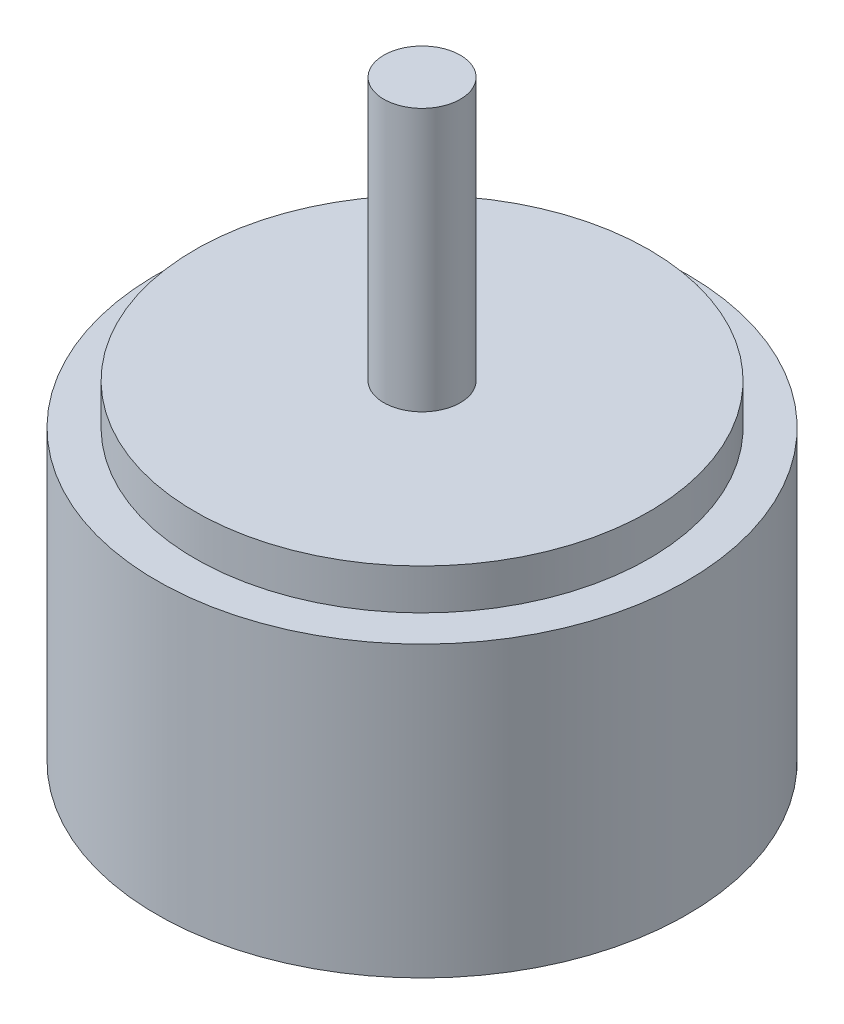
ISO-10303-21;
HEADER;
FILE_DESCRIPTION(('STEP AP214'),'2;1');
FILE_NAME('part.step','',(''),(''),'','','');
FILE_SCHEMA(('AUTOMOTIVE_DESIGN { 1 0 10303 214 1 1 1 1 }'));
ENDSEC;
DATA;
#1=APPLICATION_CONTEXT('core data for automotive mechanical design processes');
#2=APPLICATION_PROTOCOL_DEFINITION('international standard','automotive_design',2000,#1);
#3=PRODUCT_CONTEXT('',#1,'mechanical');
#4=PRODUCT('Part','Part','',(#3));
#5=PRODUCT_RELATED_PRODUCT_CATEGORY('part','',(#4));
#6=PRODUCT_DEFINITION_FORMATION('','',#4);
#7=PRODUCT_DEFINITION_CONTEXT('part definition',#1,'design');
#8=PRODUCT_DEFINITION('design','',#6,#7);
#9=PRODUCT_DEFINITION_SHAPE('','',#8);
#10=(LENGTH_UNIT() NAMED_UNIT(*) SI_UNIT(.MILLI.,.METRE.));
#11=(NAMED_UNIT(*) PLANE_ANGLE_UNIT() SI_UNIT($,.RADIAN.));
#12=(NAMED_UNIT(*) SI_UNIT($,.STERADIAN.) SOLID_ANGLE_UNIT());
#13=UNCERTAINTY_MEASURE_WITH_UNIT(LENGTH_MEASURE(1.E-05),#10,'distance_accuracy_value','');
#14=(GEOMETRIC_REPRESENTATION_CONTEXT(3) GLOBAL_UNCERTAINTY_ASSIGNED_CONTEXT((#13)) GLOBAL_UNIT_ASSIGNED_CONTEXT((#10,
#11,#12)) REPRESENTATION_CONTEXT('',''));
#15=CARTESIAN_POINT('',(0.,0.,0.));
#16=DIRECTION('',(0.,0.,1.));
#17=DIRECTION('',(1.,0.,0.));
#18=AXIS2_PLACEMENT_3D('',#15,#16,#17);
#19=CARTESIAN_POINT('',(0.,0.,0.));
#20=DIRECTION('',(0.,-1.,0.));
#21=DIRECTION('',(0.,0.,-1.));
#22=AXIS2_PLACEMENT_3D('',#19,#20,#21);
#23=PLANE('',#22);
#24=CARTESIAN_POINT('',(0.,0.,0.));
#25=DIRECTION('',(0.,-1.,0.));
#26=DIRECTION('',(0.,0.,-1.));
#27=AXIS2_PLACEMENT_3D('',#24,#25,#26);
#28=CIRCLE('',#27,11.1000000000021);
#29=CARTESIAN_POINT('',(0.,0.,-11.1000000000021));
#30=VERTEX_POINT('',#29);
#31=EDGE_CURVE('E10',#30,#30,#28,.T.);
#32=ORIENTED_EDGE('',*,*,#31,.T.);
#33=EDGE_LOOP('',(#32));
#34=FACE_BOUND('',#33,.T.);
#35=ADVANCED_FACE('F37',(#34),#23,.T.);
#36=CARTESIAN_POINT('',(0.,0.,0.));
#37=DIRECTION('',(0.,-1.,0.));
#38=DIRECTION('',(0.,0.,-1.));
#39=AXIS2_PLACEMENT_3D('',#36,#37,#38);
#40=CYLINDRICAL_SURFACE('',#39,11.100000000001);
#41=CARTESIAN_POINT('',(0.,12.1,0.));
#42=DIRECTION('',(0.,-1.,0.));
#43=DIRECTION('',(0.,0.,-1.));
#44=AXIS2_PLACEMENT_3D('',#41,#42,#43);
#45=CIRCLE('',#44,11.1);
#46=CARTESIAN_POINT('',(0.,12.1,-11.1));
#47=VERTEX_POINT('',#46);
#48=EDGE_CURVE('E43',#47,#47,#45,.T.);
#49=ORIENTED_EDGE('',*,*,#48,.T.);
#50=EDGE_LOOP('',(#49));
#51=FACE_BOUND('',#50,.T.);
#52=ORIENTED_EDGE('',*,*,#31,.F.);
#53=EDGE_LOOP('',(#52));
#54=FACE_BOUND('',#53,.T.);
#55=ADVANCED_FACE('F75',(#51,#54),#40,.T.);
#56=CARTESIAN_POINT('',(11.1,12.1,0.));
#57=DIRECTION('',(0.,1.,0.));
#58=DIRECTION('',(0.,0.,1.));
#59=AXIS2_PLACEMENT_3D('',#56,#57,#58);
#60=PLANE('',#59);
#61=CARTESIAN_POINT('',(0.,12.1,0.));
#62=DIRECTION('',(0.,-1.,0.));
#63=DIRECTION('',(0.,0.,-1.));
#64=AXIS2_PLACEMENT_3D('',#61,#62,#63);
#65=CIRCLE('',#64,9.5);
#66=CARTESIAN_POINT('',(0.,12.1,-9.5));
#67=VERTEX_POINT('',#66);
#68=EDGE_CURVE('E47',#67,#67,#65,.T.);
#69=ORIENTED_EDGE('',*,*,#68,.T.);
#70=EDGE_LOOP('',(#69));
#71=FACE_BOUND('',#70,.T.);
#72=ORIENTED_EDGE('',*,*,#48,.F.);
#73=EDGE_LOOP('',(#72));
#74=FACE_BOUND('',#73,.T.);
#75=ADVANCED_FACE('F79',(#71,#74),#60,.T.);
#76=CARTESIAN_POINT('',(0.,0.,0.));
#77=DIRECTION('',(0.,-1.,0.));
#78=DIRECTION('',(0.,0.,-1.));
#79=AXIS2_PLACEMENT_3D('',#76,#77,#78);
#80=CYLINDRICAL_SURFACE('',#79,9.5);
#81=CARTESIAN_POINT('',(0.,13.8,0.));
#82=DIRECTION('',(0.,-1.,0.));
#83=DIRECTION('',(0.,0.,-1.));
#84=AXIS2_PLACEMENT_3D('',#81,#82,#83);
#85=CIRCLE('',#84,9.5);
#86=CARTESIAN_POINT('',(0.,13.8,-9.5));
#87=VERTEX_POINT('',#86);
#88=EDGE_CURVE('E51',#87,#87,#85,.T.);
#89=ORIENTED_EDGE('',*,*,#88,.T.);
#90=EDGE_LOOP('',(#89));
#91=FACE_BOUND('',#90,.T.);
#92=ORIENTED_EDGE('',*,*,#68,.F.);
#93=EDGE_LOOP('',(#92));
#94=FACE_BOUND('',#93,.T.);
#95=ADVANCED_FACE('F83',(#91,#94),#80,.T.);
#96=CARTESIAN_POINT('',(9.5,13.8,0.));
#97=DIRECTION('',(0.,1.,0.));
#98=DIRECTION('',(0.,0.,1.));
#99=AXIS2_PLACEMENT_3D('',#96,#97,#98);
#100=PLANE('',#99);
#101=CARTESIAN_POINT('',(0.,13.8,0.));
#102=DIRECTION('',(0.,-1.,0.));
#103=DIRECTION('',(0.,0.,-1.));
#104=AXIS2_PLACEMENT_3D('',#101,#102,#103);
#105=CIRCLE('',#104,1.6);
#106=CARTESIAN_POINT('',(0.,13.8,-1.6));
#107=VERTEX_POINT('',#106);
#108=EDGE_CURVE('E56',#107,#107,#105,.T.);
#109=ORIENTED_EDGE('',*,*,#108,.T.);
#110=EDGE_LOOP('',(#109));
#111=FACE_BOUND('',#110,.T.);
#112=ORIENTED_EDGE('',*,*,#88,.F.);
#113=EDGE_LOOP('',(#112));
#114=FACE_BOUND('',#113,.T.);
#115=ADVANCED_FACE('F72',(#111,#114),#100,.T.);
#116=CARTESIAN_POINT('',(0.,0.,0.));
#117=DIRECTION('',(0.,-1.,0.));
#118=DIRECTION('',(0.,0.,-1.));
#119=AXIS2_PLACEMENT_3D('',#116,#117,#118);
#120=CYLINDRICAL_SURFACE('',#119,1.6);
#121=CARTESIAN_POINT('',(0.,24.8,0.));
#122=DIRECTION('',(0.,-1.,0.));
#123=DIRECTION('',(0.,0.,-1.));
#124=AXIS2_PLACEMENT_3D('',#121,#122,#123);
#125=CIRCLE('',#124,1.6);
#126=CARTESIAN_POINT('',(0.,24.8,-1.6));
#127=VERTEX_POINT('',#126);
#128=EDGE_CURVE('E59',#127,#127,#125,.T.);
#129=ORIENTED_EDGE('',*,*,#128,.T.);
#130=EDGE_LOOP('',(#129));
#131=FACE_BOUND('',#130,.T.);
#132=ORIENTED_EDGE('',*,*,#108,.F.);
#133=EDGE_LOOP('',(#132));
#134=FACE_BOUND('',#133,.T.);
#135=ADVANCED_FACE('F63',(#131,#134),#120,.T.);
#136=CARTESIAN_POINT('',(1.6,24.8,0.));
#137=DIRECTION('',(0.,1.,0.));
#138=DIRECTION('',(0.,0.,1.));
#139=AXIS2_PLACEMENT_3D('',#136,#137,#138);
#140=PLANE('',#139);
#141=ORIENTED_EDGE('',*,*,#128,.F.);
#142=EDGE_LOOP('',(#141));
#143=FACE_BOUND('',#142,.T.);
#144=ADVANCED_FACE('F66',(#143),#140,.T.);
#145=CLOSED_SHELL('',(#35,#55,#75,#95,#115,#135,#144));
#146=MANIFOLD_SOLID_BREP('B2',#145);
#147=ADVANCED_BREP_SHAPE_REPRESENTATION('',(#18,#146),#14);
#148=SHAPE_DEFINITION_REPRESENTATION(#9,#147);
ENDSEC;
END-ISO-10303-21;
